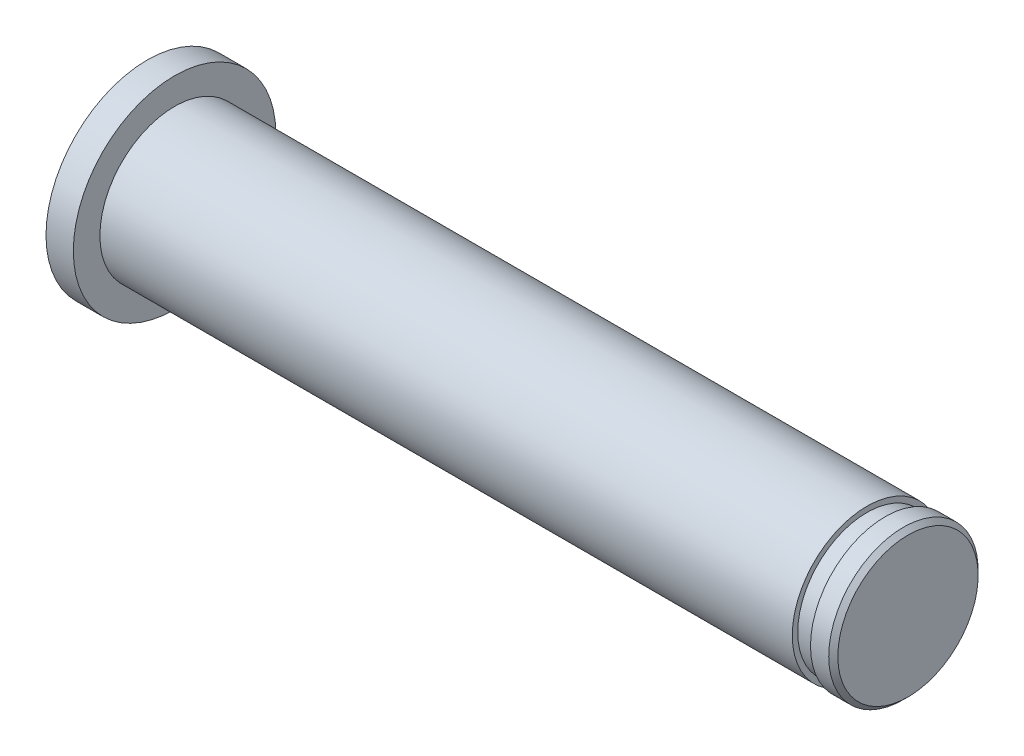
ISO-10303-21;
HEADER;
FILE_DESCRIPTION(('STEP AP214'),'2;1');
FILE_NAME('part.step','',(''),(''),'','','');
FILE_SCHEMA(('AUTOMOTIVE_DESIGN { 1 0 10303 214 1 1 1 1 }'));
ENDSEC;
DATA;
#1=APPLICATION_CONTEXT('core data for automotive mechanical design processes');
#2=APPLICATION_PROTOCOL_DEFINITION('international standard','automotive_design',2000,#1);
#3=PRODUCT_CONTEXT('',#1,'mechanical');
#4=PRODUCT('Part','Part','',(#3));
#5=PRODUCT_RELATED_PRODUCT_CATEGORY('part','',(#4));
#6=PRODUCT_DEFINITION_FORMATION('','',#4);
#7=PRODUCT_DEFINITION_CONTEXT('part definition',#1,'design');
#8=PRODUCT_DEFINITION('design','',#6,#7);
#9=PRODUCT_DEFINITION_SHAPE('','',#8);
#10=(LENGTH_UNIT() NAMED_UNIT(*) SI_UNIT(.MILLI.,.METRE.));
#11=(NAMED_UNIT(*) PLANE_ANGLE_UNIT() SI_UNIT($,.RADIAN.));
#12=(NAMED_UNIT(*) SI_UNIT($,.STERADIAN.) SOLID_ANGLE_UNIT());
#13=UNCERTAINTY_MEASURE_WITH_UNIT(LENGTH_MEASURE(1.E-05),#10,'distance_accuracy_value','');
#14=(GEOMETRIC_REPRESENTATION_CONTEXT(3) GLOBAL_UNCERTAINTY_ASSIGNED_CONTEXT((#13)) GLOBAL_UNIT_ASSIGNED_CONTEXT((#10,
#11,#12)) REPRESENTATION_CONTEXT('',''));
#15=CARTESIAN_POINT('',(0.,0.,0.));
#16=DIRECTION('',(0.,0.,1.));
#17=DIRECTION('',(1.,0.,0.));
#18=AXIS2_PLACEMENT_3D('',#15,#16,#17);
#19=CARTESIAN_POINT('',(83.5,0.,0.));
#20=DIRECTION('',(-1.,0.,0.));
#21=DIRECTION('',(0.,0.,1.));
#22=AXIS2_PLACEMENT_3D('',#19,#20,#21);
#23=PLANE('',#22);
#24=CARTESIAN_POINT('',(83.5,0.,0.));
#25=DIRECTION('',(-1.,0.,0.));
#26=DIRECTION('',(0.,0.,1.));
#27=AXIS2_PLACEMENT_3D('',#24,#25,#26);
#28=CIRCLE('',#27,7.7);
#29=CARTESIAN_POINT('',(83.5,0.,7.7));
#30=VERTEX_POINT('',#29);
#31=EDGE_CURVE('E12',#30,#30,#28,.T.);
#32=ORIENTED_EDGE('',*,*,#31,.F.);
#33=EDGE_LOOP('',(#32));
#34=FACE_BOUND('',#33,.T.);
#35=ADVANCED_FACE('F41',(#34),#23,.F.);
#36=CARTESIAN_POINT('',(83.5,0.,0.));
#37=DIRECTION('',(-1.,0.,0.));
#38=DIRECTION('',(0.,0.,1.));
#39=AXIS2_PLACEMENT_3D('',#36,#37,#38);
#40=CONICAL_SURFACE('',#39,7.7,0.785398163397448);
#41=CARTESIAN_POINT('',(83.,0.,0.));
#42=DIRECTION('',(-1.,0.,0.));
#43=DIRECTION('',(0.,0.,1.));
#44=AXIS2_PLACEMENT_3D('',#41,#42,#43);
#45=CIRCLE('',#44,8.2);
#46=CARTESIAN_POINT('',(83.,0.,8.2));
#47=VERTEX_POINT('',#46);
#48=EDGE_CURVE('E47',#47,#47,#45,.T.);
#49=ORIENTED_EDGE('',*,*,#48,.F.);
#50=EDGE_LOOP('',(#49));
#51=FACE_BOUND('',#50,.T.);
#52=ORIENTED_EDGE('',*,*,#31,.T.);
#53=EDGE_LOOP('',(#52));
#54=FACE_BOUND('',#53,.T.);
#55=ADVANCED_FACE('F116',(#51,#54),#40,.T.);
#56=CARTESIAN_POINT('',(0.,0.,0.));
#57=DIRECTION('',(-1.,0.,0.));
#58=DIRECTION('',(0.,0.,1.));
#59=AXIS2_PLACEMENT_3D('',#56,#57,#58);
#60=CYLINDRICAL_SURFACE('',#59,8.2);
#61=CARTESIAN_POINT('',(81.,0.,0.));
#62=DIRECTION('',(-1.,0.,0.));
#63=DIRECTION('',(0.,0.,1.));
#64=AXIS2_PLACEMENT_3D('',#61,#62,#63);
#65=CIRCLE('',#64,8.2);
#66=CARTESIAN_POINT('',(81.,0.,8.2));
#67=VERTEX_POINT('',#66);
#68=EDGE_CURVE('E51',#67,#67,#65,.T.);
#69=ORIENTED_EDGE('',*,*,#68,.F.);
#70=EDGE_LOOP('',(#69));
#71=FACE_BOUND('',#70,.T.);
#72=ORIENTED_EDGE('',*,*,#48,.T.);
#73=EDGE_LOOP('',(#72));
#74=FACE_BOUND('',#73,.T.);
#75=ADVANCED_FACE('F111',(#71,#74),#60,.T.);
#76=CARTESIAN_POINT('',(81.,7.59999999999999,0.));
#77=DIRECTION('',(1.,0.,0.));
#78=DIRECTION('',(0.,0.,-1.));
#79=AXIS2_PLACEMENT_3D('',#76,#77,#78);
#80=PLANE('',#79);
#81=CARTESIAN_POINT('',(81.,0.,0.));
#82=DIRECTION('',(-1.,0.,0.));
#83=DIRECTION('',(0.,0.,1.));
#84=AXIS2_PLACEMENT_3D('',#81,#82,#83);
#85=CIRCLE('',#84,7.59999999999999);
#86=CARTESIAN_POINT('',(81.,0.,7.59999999999999));
#87=VERTEX_POINT('',#86);
#88=EDGE_CURVE('E55',#87,#87,#85,.T.);
#89=ORIENTED_EDGE('',*,*,#88,.F.);
#90=EDGE_LOOP('',(#89));
#91=FACE_BOUND('',#90,.T.);
#92=ORIENTED_EDGE('',*,*,#68,.T.);
#93=EDGE_LOOP('',(#92));
#94=FACE_BOUND('',#93,.T.);
#95=ADVANCED_FACE('F105',(#91,#94),#80,.F.);
#96=CARTESIAN_POINT('',(0.,0.,0.));
#97=DIRECTION('',(-1.,0.,0.));
#98=DIRECTION('',(0.,0.,1.));
#99=AXIS2_PLACEMENT_3D('',#96,#97,#98);
#100=CYLINDRICAL_SURFACE('',#99,7.59999999999999);
#101=CARTESIAN_POINT('',(79.,0.,0.));
#102=DIRECTION('',(-1.,0.,0.));
#103=DIRECTION('',(0.,0.,1.));
#104=AXIS2_PLACEMENT_3D('',#101,#102,#103);
#105=CIRCLE('',#104,7.59999999999999);
#106=CARTESIAN_POINT('',(79.,0.,7.59999999999999));
#107=VERTEX_POINT('',#106);
#108=EDGE_CURVE('E60',#107,#107,#105,.T.);
#109=ORIENTED_EDGE('',*,*,#108,.F.);
#110=EDGE_LOOP('',(#109));
#111=FACE_BOUND('',#110,.T.);
#112=ORIENTED_EDGE('',*,*,#88,.T.);
#113=EDGE_LOOP('',(#112));
#114=FACE_BOUND('',#113,.T.);
#115=ADVANCED_FACE('F99',(#111,#114),#100,.T.);
#116=CARTESIAN_POINT('',(79.,8.2,0.));
#117=DIRECTION('',(-1.,0.,0.));
#118=DIRECTION('',(0.,0.,1.));
#119=AXIS2_PLACEMENT_3D('',#116,#117,#118);
#120=PLANE('',#119);
#121=CARTESIAN_POINT('',(79.,0.,0.));
#122=DIRECTION('',(-1.,0.,0.));
#123=DIRECTION('',(0.,0.,1.));
#124=AXIS2_PLACEMENT_3D('',#121,#122,#123);
#125=CIRCLE('',#124,8.2);
#126=CARTESIAN_POINT('',(79.,0.,8.2));
#127=VERTEX_POINT('',#126);
#128=EDGE_CURVE('E63',#127,#127,#125,.T.);
#129=ORIENTED_EDGE('',*,*,#128,.F.);
#130=EDGE_LOOP('',(#129));
#131=FACE_BOUND('',#130,.T.);
#132=ORIENTED_EDGE('',*,*,#108,.T.);
#133=EDGE_LOOP('',(#132));
#134=FACE_BOUND('',#133,.T.);
#135=ADVANCED_FACE('F93',(#131,#134),#120,.F.);
#136=CARTESIAN_POINT('',(0.,0.,0.));
#137=DIRECTION('',(-1.,0.,0.));
#138=DIRECTION('',(0.,0.,1.));
#139=AXIS2_PLACEMENT_3D('',#136,#137,#138);
#140=CYLINDRICAL_SURFACE('',#139,8.2);
#141=CARTESIAN_POINT('',(3.,0.,0.));
#142=DIRECTION('',(-1.,0.,0.));
#143=DIRECTION('',(0.,0.,1.));
#144=AXIS2_PLACEMENT_3D('',#141,#142,#143);
#145=CIRCLE('',#144,8.2);
#146=CARTESIAN_POINT('',(3.,0.,8.2));
#147=VERTEX_POINT('',#146);
#148=EDGE_CURVE('E66',#147,#147,#145,.T.);
#149=ORIENTED_EDGE('',*,*,#148,.F.);
#150=EDGE_LOOP('',(#149));
#151=FACE_BOUND('',#150,.T.);
#152=ORIENTED_EDGE('',*,*,#128,.T.);
#153=EDGE_LOOP('',(#152));
#154=FACE_BOUND('',#153,.T.);
#155=ADVANCED_FACE('F87',(#151,#154),#140,.T.);
#156=CARTESIAN_POINT('',(3.,11.115,0.));
#157=DIRECTION('',(-1.,0.,0.));
#158=DIRECTION('',(0.,0.,1.));
#159=AXIS2_PLACEMENT_3D('',#156,#157,#158);
#160=PLANE('',#159);
#161=CARTESIAN_POINT('',(3.,0.,0.));
#162=DIRECTION('',(-1.,0.,0.));
#163=DIRECTION('',(0.,0.,1.));
#164=AXIS2_PLACEMENT_3D('',#161,#162,#163);
#165=CIRCLE('',#164,11.115);
#166=CARTESIAN_POINT('',(3.,0.,11.115));
#167=VERTEX_POINT('',#166);
#168=EDGE_CURVE('E69',#167,#167,#165,.T.);
#169=ORIENTED_EDGE('',*,*,#168,.F.);
#170=EDGE_LOOP('',(#169));
#171=FACE_BOUND('',#170,.T.);
#172=ORIENTED_EDGE('',*,*,#148,.T.);
#173=EDGE_LOOP('',(#172));
#174=FACE_BOUND('',#173,.T.);
#175=ADVANCED_FACE('F81',(#171,#174),#160,.F.);
#176=CARTESIAN_POINT('',(0.,0.,0.));
#177=DIRECTION('',(-1.,0.,0.));
#178=DIRECTION('',(0.,0.,1.));
#179=AXIS2_PLACEMENT_3D('',#176,#177,#178);
#180=CYLINDRICAL_SURFACE('',#179,11.115);
#181=CARTESIAN_POINT('',(0.,0.,0.));
#182=DIRECTION('',(-1.,0.,0.));
#183=DIRECTION('',(0.,0.,1.));
#184=AXIS2_PLACEMENT_3D('',#181,#182,#183);
#185=CIRCLE('',#184,11.115);
#186=CARTESIAN_POINT('',(0.,0.,11.115));
#187=VERTEX_POINT('',#186);
#188=EDGE_CURVE('E72',#187,#187,#185,.T.);
#189=ORIENTED_EDGE('',*,*,#188,.F.);
#190=EDGE_LOOP('',(#189));
#191=FACE_BOUND('',#190,.T.);
#192=ORIENTED_EDGE('',*,*,#168,.T.);
#193=EDGE_LOOP('',(#192));
#194=FACE_BOUND('',#193,.T.);
#195=ADVANCED_FACE('F78',(#191,#194),#180,.T.);
#196=CARTESIAN_POINT('',(0.,0.,0.));
#197=DIRECTION('',(1.,0.,0.));
#198=DIRECTION('',(0.,0.,-1.));
#199=AXIS2_PLACEMENT_3D('',#196,#197,#198);
#200=PLANE('',#199);
#201=ORIENTED_EDGE('',*,*,#188,.T.);
#202=EDGE_LOOP('',(#201));
#203=FACE_BOUND('',#202,.T.);
#204=ADVANCED_FACE('F76',(#203),#200,.F.);
#205=CLOSED_SHELL('',(#35,#55,#75,#95,#115,#135,#155,#175,#195,#204));
#206=MANIFOLD_SOLID_BREP('B2',#205);
#207=ADVANCED_BREP_SHAPE_REPRESENTATION('',(#18,#206),#14);
#208=SHAPE_DEFINITION_REPRESENTATION(#9,#207);
ENDSEC;
END-ISO-10303-21;
